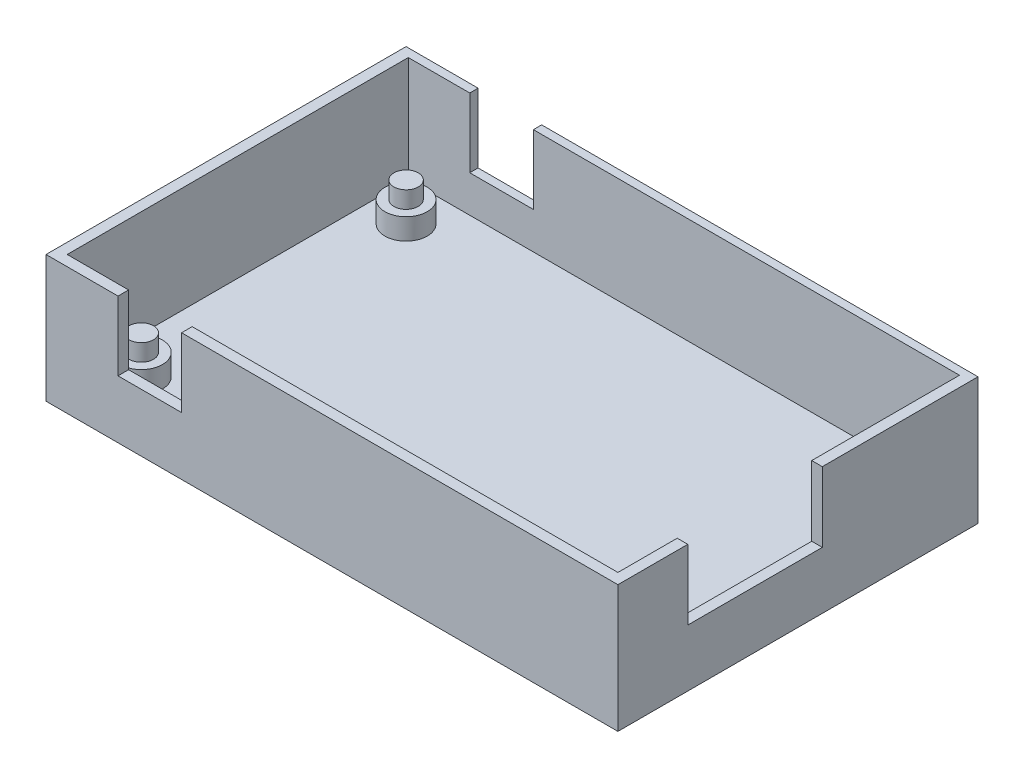
ISO-10303-21;
HEADER;
FILE_DESCRIPTION(('STEP AP214'),'2;1');
FILE_NAME('part.step','',(''),(''),'','','');
FILE_SCHEMA(('AUTOMOTIVE_DESIGN { 1 0 10303 214 1 1 1 1 }'));
ENDSEC;
DATA;
#1=APPLICATION_CONTEXT('core data for automotive mechanical design processes');
#2=APPLICATION_PROTOCOL_DEFINITION('international standard','automotive_design',2000,#1);
#3=PRODUCT_CONTEXT('',#1,'mechanical');
#4=PRODUCT('Part','Part','',(#3));
#5=PRODUCT_RELATED_PRODUCT_CATEGORY('part','',(#4));
#6=PRODUCT_DEFINITION_FORMATION('','',#4);
#7=PRODUCT_DEFINITION_CONTEXT('part definition',#1,'design');
#8=PRODUCT_DEFINITION('design','',#6,#7);
#9=PRODUCT_DEFINITION_SHAPE('','',#8);
#10=(LENGTH_UNIT() NAMED_UNIT(*) SI_UNIT(.MILLI.,.METRE.));
#11=(NAMED_UNIT(*) PLANE_ANGLE_UNIT() SI_UNIT($,.RADIAN.));
#12=(NAMED_UNIT(*) SI_UNIT($,.STERADIAN.) SOLID_ANGLE_UNIT());
#13=UNCERTAINTY_MEASURE_WITH_UNIT(LENGTH_MEASURE(1.E-05),#10,'distance_accuracy_value','');
#14=(GEOMETRIC_REPRESENTATION_CONTEXT(3) GLOBAL_UNCERTAINTY_ASSIGNED_CONTEXT((#13)) GLOBAL_UNIT_ASSIGNED_CONTEXT((#10,
#11,#12)) REPRESENTATION_CONTEXT('',''));
#15=CARTESIAN_POINT('',(0.,0.,0.));
#16=DIRECTION('',(0.,0.,1.));
#17=DIRECTION('',(1.,0.,0.));
#18=AXIS2_PLACEMENT_3D('',#15,#16,#17);
#19=CARTESIAN_POINT('',(0.,15.24,0.));
#20=DIRECTION('',(0.,1.,0.));
#21=DIRECTION('',(0.,0.,1.));
#22=AXIS2_PLACEMENT_3D('',#19,#20,#21);
#23=PLANE('',#22);
#24=DIRECTION('',(1.,0.,0.));
#25=VECTOR('',#24,1.);
#26=CARTESIAN_POINT('',(66.548,15.24,-8.382));
#27=LINE('',#26,#25);
#28=CARTESIAN_POINT('',(67.31,15.24,-8.382));
#29=VERTEX_POINT('',#28);
#30=CARTESIAN_POINT('',(68.58,15.24,-8.382));
#31=VERTEX_POINT('',#30);
#32=EDGE_CURVE('E197',#29,#31,#27,.T.);
#33=ORIENTED_EDGE('',*,*,#32,.F.);
#34=DIRECTION('',(0.,0.,-1.));
#35=VECTOR('',#34,1.);
#36=CARTESIAN_POINT('',(67.31,15.24,-1.27));
#37=LINE('',#36,#35);
#38=CARTESIAN_POINT('',(67.31,15.24,-1.27));
#39=VERTEX_POINT('',#38);
#40=EDGE_CURVE('E281',#39,#29,#37,.T.);
#41=ORIENTED_EDGE('',*,*,#40,.F.);
#42=DIRECTION('',(1.,0.,0.));
#43=VECTOR('',#42,1.);
#44=CARTESIAN_POINT('',(1.27000000000001,15.24,-1.27));
#45=LINE('',#44,#43);
#46=CARTESIAN_POINT('',(16.256,15.24,-1.27));
#47=VERTEX_POINT('',#46);
#48=EDGE_CURVE('E276',#47,#39,#45,.T.);
#49=ORIENTED_EDGE('',*,*,#48,.F.);
#50=DIRECTION('',(0.,0.,1.));
#51=VECTOR('',#50,1.);
#52=CARTESIAN_POINT('',(16.256,15.24,-43.18));
#53=LINE('',#52,#51);
#54=CARTESIAN_POINT('',(16.256,15.24,0.));
#55=VERTEX_POINT('',#54);
#56=EDGE_CURVE('E227',#47,#55,#53,.T.);
#57=ORIENTED_EDGE('',*,*,#56,.T.);
#58=DIRECTION('',(1.,0.,0.));
#59=VECTOR('',#58,1.);
#60=CARTESIAN_POINT('',(0.,15.24,0.));
#61=LINE('',#60,#59);
#62=CARTESIAN_POINT('',(68.58,15.24,0.));
#63=VERTEX_POINT('',#62);
#64=EDGE_CURVE('E311',#55,#63,#61,.T.);
#65=ORIENTED_EDGE('',*,*,#64,.T.);
#66=DIRECTION('',(0.,0.,-1.));
#67=VECTOR('',#66,1.);
#68=CARTESIAN_POINT('',(68.58,15.24,0.));
#69=LINE('',#68,#67);
#70=EDGE_CURVE('E315',#63,#31,#69,.T.);
#71=ORIENTED_EDGE('',*,*,#70,.T.);
#72=EDGE_LOOP('',(#33,#41,#49,#57,#65,#71));
#73=FACE_BOUND('',#72,.T.);
#74=ADVANCED_FACE('F33',(#73),#23,.T.);
#75=DIRECTION('',(0.,0.,1.));
#76=VECTOR('',#75,1.);
#77=CARTESIAN_POINT('',(8.636,15.24,-43.18));
#78=LINE('',#77,#76);
#79=CARTESIAN_POINT('',(8.636,15.24,-43.18));
#80=VERTEX_POINT('',#79);
#81=CARTESIAN_POINT('',(8.636,15.24,-42.1783502455858));
#82=VERTEX_POINT('',#81);
#83=EDGE_CURVE('E220',#80,#82,#78,.T.);
#84=ORIENTED_EDGE('',*,*,#83,.F.);
#85=DIRECTION('',(-1.,0.,0.));
#86=VECTOR('',#85,1.);
#87=CARTESIAN_POINT('',(68.58,15.24,-43.18));
#88=LINE('',#87,#86);
#89=CARTESIAN_POINT('',(0.,15.24,-43.18));
#90=VERTEX_POINT('',#89);
#91=EDGE_CURVE('E304',#80,#90,#88,.T.);
#92=ORIENTED_EDGE('',*,*,#91,.T.);
#93=DIRECTION('',(0.,0.,1.));
#94=VECTOR('',#93,1.);
#95=CARTESIAN_POINT('',(0.,15.24,-43.18));
#96=LINE('',#95,#94);
#97=CARTESIAN_POINT('',(0.,15.24,0.));
#98=VERTEX_POINT('',#97);
#99=EDGE_CURVE('E308',#90,#98,#96,.T.);
#100=ORIENTED_EDGE('',*,*,#99,.T.);
#101=CARTESIAN_POINT('',(8.636,15.24,0.));
#102=VERTEX_POINT('',#101);
#103=EDGE_CURVE('E312',#98,#102,#61,.T.);
#104=ORIENTED_EDGE('',*,*,#103,.T.);
#105=CARTESIAN_POINT('',(8.636,15.24,-1.27));
#106=VERTEX_POINT('',#105);
#107=EDGE_CURVE('E223',#106,#102,#78,.T.);
#108=ORIENTED_EDGE('',*,*,#107,.F.);
#109=CARTESIAN_POINT('',(1.27000000000001,15.24,-1.27));
#110=VERTEX_POINT('',#109);
#111=EDGE_CURVE('E277',#110,#106,#45,.T.);
#112=ORIENTED_EDGE('',*,*,#111,.F.);
#113=DIRECTION('',(0.,0.,1.));
#114=VECTOR('',#113,1.);
#115=CARTESIAN_POINT('',(1.27,15.24,-42.171922196319));
#116=LINE('',#115,#114);
#117=CARTESIAN_POINT('',(1.27,15.24,-42.171922196319));
#118=VERTEX_POINT('',#117);
#119=EDGE_CURVE('E273',#118,#110,#116,.T.);
#120=ORIENTED_EDGE('',*,*,#119,.F.);
#121=DIRECTION('',(-0.99999961922825,0.,0.000872664515221241));
#122=VECTOR('',#121,1.);
#123=CARTESIAN_POINT('',(67.31,15.24,-42.2295529828484));
#124=LINE('',#123,#122);
#125=EDGE_CURVE('E274',#82,#118,#124,.T.);
#126=ORIENTED_EDGE('',*,*,#125,.F.);
#127=EDGE_LOOP('',(#84,#92,#100,#104,#108,#112,#120,#126));
#128=FACE_BOUND('',#127,.T.);
#129=ADVANCED_FACE('F386',(#128),#23,.T.);
#130=CARTESIAN_POINT('',(62.865,5.08,-37.465));
#131=DIRECTION('',(0.,1.,0.));
#132=DIRECTION('',(0.,0.,1.));
#133=AXIS2_PLACEMENT_3D('',#130,#131,#132);
#134=PLANE('',#133);
#135=CARTESIAN_POINT('',(62.865,5.08,-37.465));
#136=DIRECTION('',(0.,1.,0.));
#137=DIRECTION('',(0.,0.,1.));
#138=AXIS2_PLACEMENT_3D('',#135,#136,#137);
#139=CIRCLE('',#138,2.54);
#140=CARTESIAN_POINT('',(62.865,5.08,-34.925));
#141=VERTEX_POINT('',#140);
#142=EDGE_CURVE('E324',#141,#141,#139,.T.);
#143=ORIENTED_EDGE('',*,*,#142,.T.);
#144=EDGE_LOOP('',(#143));
#145=FACE_BOUND('',#144,.T.);
#146=CARTESIAN_POINT('',(62.865,5.08,-37.465));
#147=DIRECTION('',(0.,1.,0.));
#148=DIRECTION('',(0.,0.,1.));
#149=AXIS2_PLACEMENT_3D('',#146,#147,#148);
#150=CIRCLE('',#149,1.4605);
#151=CARTESIAN_POINT('',(62.865,5.08,-36.0045));
#152=VERTEX_POINT('',#151);
#153=EDGE_CURVE('E245',#152,#152,#150,.T.);
#154=ORIENTED_EDGE('',*,*,#153,.F.);
#155=EDGE_LOOP('',(#154));
#156=FACE_BOUND('',#155,.T.);
#157=ADVANCED_FACE('F398',(#145,#156),#134,.T.);
#158=CARTESIAN_POINT('',(62.865,5.08,-5.715));
#159=DIRECTION('',(0.,1.,0.));
#160=DIRECTION('',(0.,0.,1.));
#161=AXIS2_PLACEMENT_3D('',#158,#159,#160);
#162=PLANE('',#161);
#163=CARTESIAN_POINT('',(62.865,5.08,-5.715));
#164=DIRECTION('',(0.,1.,0.));
#165=DIRECTION('',(0.,0.,1.));
#166=AXIS2_PLACEMENT_3D('',#163,#164,#165);
#167=CIRCLE('',#166,2.54);
#168=CARTESIAN_POINT('',(62.865,5.08,-3.175));
#169=VERTEX_POINT('',#168);
#170=EDGE_CURVE('E318',#169,#169,#167,.T.);
#171=ORIENTED_EDGE('',*,*,#170,.T.);
#172=EDGE_LOOP('',(#171));
#173=FACE_BOUND('',#172,.T.);
#174=CARTESIAN_POINT('',(62.865,5.08,-5.715));
#175=DIRECTION('',(0.,1.,0.));
#176=DIRECTION('',(0.,0.,1.));
#177=AXIS2_PLACEMENT_3D('',#174,#175,#176);
#178=CIRCLE('',#177,1.4605);
#179=CARTESIAN_POINT('',(62.865,5.08,-4.2545));
#180=VERTEX_POINT('',#179);
#181=EDGE_CURVE('E249',#180,#180,#178,.T.);
#182=ORIENTED_EDGE('',*,*,#181,.F.);
#183=EDGE_LOOP('',(#182));
#184=FACE_BOUND('',#183,.T.);
#185=ADVANCED_FACE('F403',(#173,#184),#162,.T.);
#186=CARTESIAN_POINT('',(5.71500000000001,5.08,-5.715));
#187=DIRECTION('',(0.,1.,0.));
#188=DIRECTION('',(0.,0.,1.));
#189=AXIS2_PLACEMENT_3D('',#186,#187,#188);
#190=PLANE('',#189);
#191=CARTESIAN_POINT('',(5.71500000000001,5.08,-5.715));
#192=DIRECTION('',(0.,1.,0.));
#193=DIRECTION('',(0.,0.,1.));
#194=AXIS2_PLACEMENT_3D('',#191,#192,#193);
#195=CIRCLE('',#194,2.54);
#196=CARTESIAN_POINT('',(5.71500000000001,5.08,-3.175));
#197=VERTEX_POINT('',#196);
#198=EDGE_CURVE('E321',#197,#197,#195,.T.);
#199=ORIENTED_EDGE('',*,*,#198,.T.);
#200=EDGE_LOOP('',(#199));
#201=FACE_BOUND('',#200,.T.);
#202=CARTESIAN_POINT('',(5.71500000000001,5.08,-5.715));
#203=DIRECTION('',(0.,1.,0.));
#204=DIRECTION('',(0.,0.,1.));
#205=AXIS2_PLACEMENT_3D('',#202,#203,#204);
#206=CIRCLE('',#205,1.4605);
#207=CARTESIAN_POINT('',(5.71500000000001,5.08,-4.2545));
#208=VERTEX_POINT('',#207);
#209=EDGE_CURVE('E255',#208,#208,#206,.T.);
#210=ORIENTED_EDGE('',*,*,#209,.F.);
#211=EDGE_LOOP('',(#210));
#212=FACE_BOUND('',#211,.T.);
#213=ADVANCED_FACE('F405',(#201,#212),#190,.T.);
#214=CARTESIAN_POINT('',(5.715,5.08,-37.465));
#215=DIRECTION('',(0.,1.,0.));
#216=DIRECTION('',(0.,0.,1.));
#217=AXIS2_PLACEMENT_3D('',#214,#215,#216);
#218=PLANE('',#217);
#219=CARTESIAN_POINT('',(5.715,5.08,-37.465));
#220=DIRECTION('',(0.,1.,0.));
#221=DIRECTION('',(0.,0.,1.));
#222=AXIS2_PLACEMENT_3D('',#219,#220,#221);
#223=CIRCLE('',#222,2.54);
#224=CARTESIAN_POINT('',(5.715,5.08,-34.925));
#225=VERTEX_POINT('',#224);
#226=EDGE_CURVE('E327',#225,#225,#223,.T.);
#227=ORIENTED_EDGE('',*,*,#226,.T.);
#228=EDGE_LOOP('',(#227));
#229=FACE_BOUND('',#228,.T.);
#230=CARTESIAN_POINT('',(5.715,5.08,-37.465));
#231=DIRECTION('',(0.,1.,0.));
#232=DIRECTION('',(0.,0.,1.));
#233=AXIS2_PLACEMENT_3D('',#230,#231,#232);
#234=CIRCLE('',#233,1.4605);
#235=CARTESIAN_POINT('',(5.715,5.08,-36.0045));
#236=VERTEX_POINT('',#235);
#237=EDGE_CURVE('E261',#236,#236,#234,.T.);
#238=ORIENTED_EDGE('',*,*,#237,.F.);
#239=EDGE_LOOP('',(#238));
#240=FACE_BOUND('',#239,.T.);
#241=ADVANCED_FACE('F365',(#229,#240),#218,.T.);
#242=CARTESIAN_POINT('',(0.,2.54,0.));
#243=DIRECTION('',(0.,-1.,0.));
#244=DIRECTION('',(0.,0.,-1.));
#245=AXIS2_PLACEMENT_3D('',#242,#243,#244);
#246=PLANE('',#245);
#247=DIRECTION('',(0.,0.,-1.));
#248=VECTOR('',#247,1.);
#249=CARTESIAN_POINT('',(67.31,2.54,-1.27));
#250=LINE('',#249,#248);
#251=CARTESIAN_POINT('',(67.31,2.54,-1.27));
#252=VERTEX_POINT('',#251);
#253=CARTESIAN_POINT('',(67.31,2.54,-42.2295529828484));
#254=VERTEX_POINT('',#253);
#255=EDGE_CURVE('E293',#252,#254,#250,.T.);
#256=ORIENTED_EDGE('',*,*,#255,.T.);
#257=DIRECTION('',(-0.99999961922825,0.,0.000872664515221241));
#258=VECTOR('',#257,1.);
#259=CARTESIAN_POINT('',(67.31,2.54,-42.2295529828484));
#260=LINE('',#259,#258);
#261=CARTESIAN_POINT('',(1.27,2.54,-42.171922196319));
#262=VERTEX_POINT('',#261);
#263=EDGE_CURVE('E267',#254,#262,#260,.T.);
#264=ORIENTED_EDGE('',*,*,#263,.T.);
#265=DIRECTION('',(0.,0.,1.));
#266=VECTOR('',#265,1.);
#267=CARTESIAN_POINT('',(1.27,2.54,-42.171922196319));
#268=LINE('',#267,#266);
#269=CARTESIAN_POINT('',(1.27000000000001,2.54,-1.27));
#270=VERTEX_POINT('',#269);
#271=EDGE_CURVE('E287',#262,#270,#268,.T.);
#272=ORIENTED_EDGE('',*,*,#271,.T.);
#273=DIRECTION('',(1.,0.,0.));
#274=VECTOR('',#273,1.);
#275=CARTESIAN_POINT('',(1.27000000000001,2.54,-1.27));
#276=LINE('',#275,#274);
#277=EDGE_CURVE('E290',#270,#252,#276,.T.);
#278=ORIENTED_EDGE('',*,*,#277,.T.);
#279=EDGE_LOOP('',(#256,#264,#272,#278));
#280=FACE_BOUND('',#279,.T.);
#281=CARTESIAN_POINT('',(5.71500000000001,2.54,-5.715));
#282=DIRECTION('',(0.,-1.,0.));
#283=DIRECTION('',(0.,0.,-1.));
#284=AXIS2_PLACEMENT_3D('',#281,#282,#283);
#285=CIRCLE('',#284,2.54);
#286=CARTESIAN_POINT('',(5.71500000000001,2.54,-8.255));
#287=VERTEX_POINT('',#286);
#288=EDGE_CURVE('E41',#287,#287,#285,.F.);
#289=ORIENTED_EDGE('',*,*,#288,.F.);
#290=EDGE_LOOP('',(#289));
#291=FACE_BOUND('',#290,.T.);
#292=CARTESIAN_POINT('',(5.715,2.54,-37.465));
#293=DIRECTION('',(0.,-1.,0.));
#294=DIRECTION('',(0.,0.,-1.));
#295=AXIS2_PLACEMENT_3D('',#292,#293,#294);
#296=CIRCLE('',#295,2.54);
#297=CARTESIAN_POINT('',(5.715,2.54,-40.005));
#298=VERTEX_POINT('',#297);
#299=EDGE_CURVE('E351',#298,#298,#296,.F.);
#300=ORIENTED_EDGE('',*,*,#299,.F.);
#301=EDGE_LOOP('',(#300));
#302=FACE_BOUND('',#301,.T.);
#303=CARTESIAN_POINT('',(62.865,2.54,-37.465));
#304=DIRECTION('',(0.,-1.,0.));
#305=DIRECTION('',(0.,0.,-1.));
#306=AXIS2_PLACEMENT_3D('',#303,#304,#305);
#307=CIRCLE('',#306,2.54);
#308=CARTESIAN_POINT('',(62.865,2.54,-40.005));
#309=VERTEX_POINT('',#308);
#310=EDGE_CURVE('E354',#309,#309,#307,.F.);
#311=ORIENTED_EDGE('',*,*,#310,.F.);
#312=EDGE_LOOP('',(#311));
#313=FACE_BOUND('',#312,.T.);
#314=CARTESIAN_POINT('',(62.865,2.54,-5.715));
#315=DIRECTION('',(0.,-1.,0.));
#316=DIRECTION('',(0.,0.,-1.));
#317=AXIS2_PLACEMENT_3D('',#314,#315,#316);
#318=CIRCLE('',#317,2.54);
#319=CARTESIAN_POINT('',(62.865,2.54,-8.25499999999999));
#320=VERTEX_POINT('',#319);
#321=EDGE_CURVE('E11',#320,#320,#318,.F.);
#322=ORIENTED_EDGE('',*,*,#321,.F.);
#323=EDGE_LOOP('',(#322));
#324=FACE_BOUND('',#323,.T.);
#325=ADVANCED_FACE('F361',(#280,#291,#302,#313,#324),#246,.F.);
#326=CARTESIAN_POINT('',(5.715,5.08,-37.465));
#327=DIRECTION('',(0.,-1.,0.));
#328=DIRECTION('',(0.,0.,-1.));
#329=AXIS2_PLACEMENT_3D('',#326,#327,#328);
#330=CYLINDRICAL_SURFACE('',#329,2.54);
#331=ORIENTED_EDGE('',*,*,#226,.F.);
#332=EDGE_LOOP('',(#331));
#333=FACE_BOUND('',#332,.T.);
#334=ORIENTED_EDGE('',*,*,#299,.T.);
#335=EDGE_LOOP('',(#334));
#336=FACE_BOUND('',#335,.T.);
#337=ADVANCED_FACE('F364',(#333,#336),#330,.T.);
#338=CARTESIAN_POINT('',(62.865,5.08,-37.465));
#339=DIRECTION('',(0.,-1.,0.));
#340=DIRECTION('',(0.,0.,-1.));
#341=AXIS2_PLACEMENT_3D('',#338,#339,#340);
#342=CYLINDRICAL_SURFACE('',#341,2.54);
#343=ORIENTED_EDGE('',*,*,#142,.F.);
#344=EDGE_LOOP('',(#343));
#345=FACE_BOUND('',#344,.T.);
#346=ORIENTED_EDGE('',*,*,#310,.T.);
#347=EDGE_LOOP('',(#346));
#348=FACE_BOUND('',#347,.T.);
#349=ADVANCED_FACE('F387',(#345,#348),#342,.T.);
#350=CARTESIAN_POINT('',(5.71500000000001,5.08,-5.715));
#351=DIRECTION('',(0.,-1.,0.));
#352=DIRECTION('',(0.,0.,-1.));
#353=AXIS2_PLACEMENT_3D('',#350,#351,#352);
#354=CYLINDRICAL_SURFACE('',#353,2.54);
#355=ORIENTED_EDGE('',*,*,#198,.F.);
#356=EDGE_LOOP('',(#355));
#357=FACE_BOUND('',#356,.T.);
#358=ORIENTED_EDGE('',*,*,#288,.T.);
#359=EDGE_LOOP('',(#358));
#360=FACE_BOUND('',#359,.T.);
#361=ADVANCED_FACE('F359',(#357,#360),#354,.T.);
#362=CARTESIAN_POINT('',(62.865,5.08,-5.715));
#363=DIRECTION('',(0.,-1.,0.));
#364=DIRECTION('',(0.,0.,-1.));
#365=AXIS2_PLACEMENT_3D('',#362,#363,#364);
#366=CYLINDRICAL_SURFACE('',#365,2.54);
#367=ORIENTED_EDGE('',*,*,#170,.F.);
#368=EDGE_LOOP('',(#367));
#369=FACE_BOUND('',#368,.T.);
#370=ORIENTED_EDGE('',*,*,#321,.T.);
#371=EDGE_LOOP('',(#370));
#372=FACE_BOUND('',#371,.T.);
#373=ADVANCED_FACE('F374',(#369,#372),#366,.T.);
#374=DIRECTION('',(1.,0.,0.));
#375=VECTOR('',#374,1.);
#376=CARTESIAN_POINT('',(66.548,15.24,-24.511));
#377=LINE('',#376,#375);
#378=CARTESIAN_POINT('',(67.31,15.24,-24.511));
#379=VERTEX_POINT('',#378);
#380=CARTESIAN_POINT('',(68.58,15.24,-24.511));
#381=VERTEX_POINT('',#380);
#382=EDGE_CURVE('E181',#379,#381,#377,.T.);
#383=ORIENTED_EDGE('',*,*,#382,.T.);
#384=CARTESIAN_POINT('',(68.58,15.24,-43.18));
#385=VERTEX_POINT('',#384);
#386=EDGE_CURVE('E192',#381,#385,#69,.T.);
#387=ORIENTED_EDGE('',*,*,#386,.T.);
#388=CARTESIAN_POINT('',(16.256,15.24,-43.18));
#389=VERTEX_POINT('',#388);
#390=EDGE_CURVE('E305',#385,#389,#88,.T.);
#391=ORIENTED_EDGE('',*,*,#390,.T.);
#392=CARTESIAN_POINT('',(16.256,15.24,-42.1849999517238));
#393=VERTEX_POINT('',#392);
#394=EDGE_CURVE('E224',#389,#393,#53,.T.);
#395=ORIENTED_EDGE('',*,*,#394,.T.);
#396=CARTESIAN_POINT('',(67.31,15.24,-42.2295529828484));
#397=VERTEX_POINT('',#396);
#398=EDGE_CURVE('E270',#397,#393,#124,.T.);
#399=ORIENTED_EDGE('',*,*,#398,.F.);
#400=EDGE_CURVE('E280',#379,#397,#37,.T.);
#401=ORIENTED_EDGE('',*,*,#400,.F.);
#402=EDGE_LOOP('',(#383,#387,#391,#395,#399,#401));
#403=FACE_BOUND('',#402,.T.);
#404=ADVANCED_FACE('F376',(#403),#23,.T.);
#405=CARTESIAN_POINT('',(67.31,15.24,-42.2295529828484));
#406=DIRECTION('',(0.000872664515221241,0.,0.999999619228249));
#407=DIRECTION('',(0.999999619228249,0.,-0.000872664515221241));
#408=AXIS2_PLACEMENT_3D('',#405,#406,#407);
#409=PLANE('',#408);
#410=DIRECTION('',(0.,-1.,0.));
#411=VECTOR('',#410,1.);
#412=CARTESIAN_POINT('',(8.636,15.24,-42.1783502455858));
#413=LINE('',#412,#411);
#414=CARTESIAN_POINT('',(8.63600000000001,6.9543676,-42.1783502455858));
#415=VERTEX_POINT('',#414);
#416=EDGE_CURVE('E243',#82,#415,#413,.T.);
#417=ORIENTED_EDGE('',*,*,#416,.F.);
#418=ORIENTED_EDGE('',*,*,#125,.T.);
#419=DIRECTION('',(0.,-1.,0.));
#420=VECTOR('',#419,1.);
#421=CARTESIAN_POINT('',(1.27,15.24,-42.171922196319));
#422=LINE('',#421,#420);
#423=EDGE_CURVE('E301',#118,#262,#422,.T.);
#424=ORIENTED_EDGE('',*,*,#423,.T.);
#425=ORIENTED_EDGE('',*,*,#263,.F.);
#426=DIRECTION('',(0.,-1.,0.));
#427=VECTOR('',#426,1.);
#428=CARTESIAN_POINT('',(67.31,15.24,-42.2295529828484));
#429=LINE('',#428,#427);
#430=EDGE_CURVE('E284',#397,#254,#429,.T.);
#431=ORIENTED_EDGE('',*,*,#430,.F.);
#432=ORIENTED_EDGE('',*,*,#398,.T.);
#433=DIRECTION('',(0.,1.,0.));
#434=VECTOR('',#433,1.);
#435=CARTESIAN_POINT('',(16.256,15.24,-42.1849999517238));
#436=LINE('',#435,#434);
#437=CARTESIAN_POINT('',(16.256,6.9543676,-42.1849999517238));
#438=VERTEX_POINT('',#437);
#439=EDGE_CURVE('E239',#438,#393,#436,.T.);
#440=ORIENTED_EDGE('',*,*,#439,.F.);
#441=DIRECTION('',(0.999999619228249,0.,-0.000872664515221241));
#442=VECTOR('',#441,1.);
#443=CARTESIAN_POINT('',(67.31,6.9543676,-42.2295529828484));
#444=LINE('',#443,#442);
#445=EDGE_CURVE('E235',#415,#438,#444,.T.);
#446=ORIENTED_EDGE('',*,*,#445,.F.);
#447=EDGE_LOOP('',(#417,#418,#424,#425,#431,#432,#440,#446));
#448=FACE_BOUND('',#447,.T.);
#449=ADVANCED_FACE('F383',(#448),#409,.T.);
#450=CARTESIAN_POINT('',(1.27,15.24,-42.171922196319));
#451=DIRECTION('',(1.,0.,0.));
#452=DIRECTION('',(0.,0.,-1.));
#453=AXIS2_PLACEMENT_3D('',#450,#451,#452);
#454=PLANE('',#453);
#455=ORIENTED_EDGE('',*,*,#271,.F.);
#456=ORIENTED_EDGE('',*,*,#423,.F.);
#457=ORIENTED_EDGE('',*,*,#119,.T.);
#458=DIRECTION('',(0.,-1.,0.));
#459=VECTOR('',#458,1.);
#460=CARTESIAN_POINT('',(1.27000000000001,15.24,-1.27));
#461=LINE('',#460,#459);
#462=EDGE_CURVE('E299',#110,#270,#461,.T.);
#463=ORIENTED_EDGE('',*,*,#462,.T.);
#464=EDGE_LOOP('',(#455,#456,#457,#463));
#465=FACE_BOUND('',#464,.T.);
#466=ADVANCED_FACE('F454',(#465),#454,.T.);
#467=CARTESIAN_POINT('',(1.27000000000001,15.24,-1.27));
#468=DIRECTION('',(0.,0.,-1.));
#469=DIRECTION('',(-1.,0.,0.));
#470=AXIS2_PLACEMENT_3D('',#467,#468,#469);
#471=PLANE('',#470);
#472=DIRECTION('',(0.,1.,0.));
#473=VECTOR('',#472,1.);
#474=CARTESIAN_POINT('',(8.636,15.24,-1.27));
#475=LINE('',#474,#473);
#476=CARTESIAN_POINT('',(8.636,6.9543676,-1.27));
#477=VERTEX_POINT('',#476);
#478=EDGE_CURVE('E241',#477,#106,#475,.T.);
#479=ORIENTED_EDGE('',*,*,#478,.F.);
#480=DIRECTION('',(-1.,0.,0.));
#481=VECTOR('',#480,1.);
#482=CARTESIAN_POINT('',(1.27000000000001,6.9543676,-1.27));
#483=LINE('',#482,#481);
#484=CARTESIAN_POINT('',(16.256,6.9543676,-1.27));
#485=VERTEX_POINT('',#484);
#486=EDGE_CURVE('E222',#485,#477,#483,.T.);
#487=ORIENTED_EDGE('',*,*,#486,.F.);
#488=DIRECTION('',(0.,-1.,0.));
#489=VECTOR('',#488,1.);
#490=CARTESIAN_POINT('',(16.256,15.24,-1.27));
#491=LINE('',#490,#489);
#492=EDGE_CURVE('E237',#47,#485,#491,.T.);
#493=ORIENTED_EDGE('',*,*,#492,.F.);
#494=ORIENTED_EDGE('',*,*,#48,.T.);
#495=DIRECTION('',(0.,-1.,0.));
#496=VECTOR('',#495,1.);
#497=CARTESIAN_POINT('',(67.31,15.24,-1.27));
#498=LINE('',#497,#496);
#499=EDGE_CURVE('E297',#39,#252,#498,.T.);
#500=ORIENTED_EDGE('',*,*,#499,.T.);
#501=ORIENTED_EDGE('',*,*,#277,.F.);
#502=ORIENTED_EDGE('',*,*,#462,.F.);
#503=ORIENTED_EDGE('',*,*,#111,.T.);
#504=EDGE_LOOP('',(#479,#487,#493,#494,#500,#501,#502,#503));
#505=FACE_BOUND('',#504,.T.);
#506=ADVANCED_FACE('F451',(#505),#471,.T.);
#507=CARTESIAN_POINT('',(67.31,15.24,-1.27));
#508=DIRECTION('',(-1.,0.,0.));
#509=DIRECTION('',(0.,0.,1.));
#510=AXIS2_PLACEMENT_3D('',#507,#508,#509);
#511=PLANE('',#510);
#512=DIRECTION('',(0.,1.,0.));
#513=VECTOR('',#512,1.);
#514=CARTESIAN_POINT('',(67.31,15.24,-8.382));
#515=LINE('',#514,#513);
#516=CARTESIAN_POINT('',(67.31,6.858,-8.382));
#517=VERTEX_POINT('',#516);
#518=EDGE_CURVE('E203',#517,#29,#515,.T.);
#519=ORIENTED_EDGE('',*,*,#518,.F.);
#520=DIRECTION('',(0.,0.,1.));
#521=VECTOR('',#520,1.);
#522=CARTESIAN_POINT('',(67.31,6.858,-1.27));
#523=LINE('',#522,#521);
#524=CARTESIAN_POINT('',(67.31,6.858,-24.511));
#525=VERTEX_POINT('',#524);
#526=EDGE_CURVE('E199',#525,#517,#523,.T.);
#527=ORIENTED_EDGE('',*,*,#526,.F.);
#528=DIRECTION('',(0.,-1.,0.));
#529=VECTOR('',#528,1.);
#530=CARTESIAN_POINT('',(67.31,15.24,-24.511));
#531=LINE('',#530,#529);
#532=EDGE_CURVE('E178',#379,#525,#531,.T.);
#533=ORIENTED_EDGE('',*,*,#532,.F.);
#534=ORIENTED_EDGE('',*,*,#400,.T.);
#535=ORIENTED_EDGE('',*,*,#430,.T.);
#536=ORIENTED_EDGE('',*,*,#255,.F.);
#537=ORIENTED_EDGE('',*,*,#499,.F.);
#538=ORIENTED_EDGE('',*,*,#40,.T.);
#539=EDGE_LOOP('',(#519,#527,#533,#534,#535,#536,#537,#538));
#540=FACE_BOUND('',#539,.T.);
#541=ADVANCED_FACE('F447',(#540),#511,.T.);
#542=CARTESIAN_POINT('',(0.,0.,0.));
#543=DIRECTION('',(0.,-1.,0.));
#544=DIRECTION('',(0.,0.,-1.));
#545=AXIS2_PLACEMENT_3D('',#542,#543,#544);
#546=PLANE('',#545);
#547=DIRECTION('',(0.,0.,1.));
#548=VECTOR('',#547,1.);
#549=CARTESIAN_POINT('',(0.,0.,0.));
#550=LINE('',#549,#548);
#551=CARTESIAN_POINT('',(0.,0.,-43.18));
#552=VERTEX_POINT('',#551);
#553=CARTESIAN_POINT('',(0.,0.,0.));
#554=VERTEX_POINT('',#553);
#555=EDGE_CURVE('E330',#552,#554,#550,.T.);
#556=ORIENTED_EDGE('',*,*,#555,.F.);
#557=DIRECTION('',(-1.,0.,0.));
#558=VECTOR('',#557,1.);
#559=CARTESIAN_POINT('',(0.,0.,-43.18));
#560=LINE('',#559,#558);
#561=CARTESIAN_POINT('',(68.58,0.,-43.18));
#562=VERTEX_POINT('',#561);
#563=EDGE_CURVE('E337',#562,#552,#560,.T.);
#564=ORIENTED_EDGE('',*,*,#563,.F.);
#565=DIRECTION('',(0.,0.,-1.));
#566=VECTOR('',#565,1.);
#567=CARTESIAN_POINT('',(68.58,0.,0.));
#568=LINE('',#567,#566);
#569=CARTESIAN_POINT('',(68.58,0.,0.));
#570=VERTEX_POINT('',#569);
#571=EDGE_CURVE('E335',#570,#562,#568,.T.);
#572=ORIENTED_EDGE('',*,*,#571,.F.);
#573=DIRECTION('',(1.,0.,0.));
#574=VECTOR('',#573,1.);
#575=CARTESIAN_POINT('',(0.,0.,0.));
#576=LINE('',#575,#574);
#577=EDGE_CURVE('E333',#554,#570,#576,.T.);
#578=ORIENTED_EDGE('',*,*,#577,.F.);
#579=EDGE_LOOP('',(#556,#564,#572,#578));
#580=FACE_BOUND('',#579,.T.);
#581=ADVANCED_FACE('F450',(#580),#546,.T.);
#582=CARTESIAN_POINT('',(0.,2.54,-43.18));
#583=DIRECTION('',(0.,0.,1.));
#584=DIRECTION('',(1.,0.,0.));
#585=AXIS2_PLACEMENT_3D('',#582,#583,#584);
#586=PLANE('',#585);
#587=ORIENTED_EDGE('',*,*,#91,.F.);
#588=DIRECTION('',(0.,-1.,0.));
#589=VECTOR('',#588,1.);
#590=CARTESIAN_POINT('',(8.636,15.24,-43.18));
#591=LINE('',#590,#589);
#592=CARTESIAN_POINT('',(8.636,6.9543676,-43.18));
#593=VERTEX_POINT('',#592);
#594=EDGE_CURVE('E206',#80,#593,#591,.T.);
#595=ORIENTED_EDGE('',*,*,#594,.T.);
#596=DIRECTION('',(1.,0.,0.));
#597=VECTOR('',#596,1.);
#598=CARTESIAN_POINT('',(8.636,6.9543676,-43.18));
#599=LINE('',#598,#597);
#600=CARTESIAN_POINT('',(16.256,6.9543676,-43.18));
#601=VERTEX_POINT('',#600);
#602=EDGE_CURVE('E209',#593,#601,#599,.T.);
#603=ORIENTED_EDGE('',*,*,#602,.T.);
#604=DIRECTION('',(0.,1.,0.));
#605=VECTOR('',#604,1.);
#606=CARTESIAN_POINT('',(16.256,15.24,-43.18));
#607=LINE('',#606,#605);
#608=EDGE_CURVE('E56',#601,#389,#607,.T.);
#609=ORIENTED_EDGE('',*,*,#608,.T.);
#610=ORIENTED_EDGE('',*,*,#390,.F.);
#611=DIRECTION('',(0.,-1.,0.));
#612=VECTOR('',#611,1.);
#613=CARTESIAN_POINT('',(68.58,2.54,-43.18));
#614=LINE('',#613,#612);
#615=EDGE_CURVE('E342',#385,#562,#614,.T.);
#616=ORIENTED_EDGE('',*,*,#615,.T.);
#617=ORIENTED_EDGE('',*,*,#563,.T.);
#618=DIRECTION('',(0.,-1.,0.));
#619=VECTOR('',#618,1.);
#620=CARTESIAN_POINT('',(0.,2.54,-43.18));
#621=LINE('',#620,#619);
#622=EDGE_CURVE('E339',#90,#552,#621,.T.);
#623=ORIENTED_EDGE('',*,*,#622,.F.);
#624=EDGE_LOOP('',(#587,#595,#603,#609,#610,#616,#617,#623));
#625=FACE_BOUND('',#624,.T.);
#626=ADVANCED_FACE('F481',(#625),#586,.F.);
#627=CARTESIAN_POINT('',(68.58,2.54,0.));
#628=DIRECTION('',(-1.,0.,0.));
#629=DIRECTION('',(0.,0.,1.));
#630=AXIS2_PLACEMENT_3D('',#627,#628,#629);
#631=PLANE('',#630);
#632=DIRECTION('',(0.,0.,-1.));
#633=VECTOR('',#632,1.);
#634=CARTESIAN_POINT('',(68.58,6.858,-8.382));
#635=LINE('',#634,#633);
#636=CARTESIAN_POINT('',(68.58,6.858,-8.382));
#637=VERTEX_POINT('',#636);
#638=CARTESIAN_POINT('',(68.58,6.858,-24.511));
#639=VERTEX_POINT('',#638);
#640=EDGE_CURVE('E185',#637,#639,#635,.T.);
#641=ORIENTED_EDGE('',*,*,#640,.F.);
#642=DIRECTION('',(0.,-1.,0.));
#643=VECTOR('',#642,1.);
#644=CARTESIAN_POINT('',(68.58,15.24,-8.382));
#645=LINE('',#644,#643);
#646=EDGE_CURVE('E48',#31,#637,#645,.T.);
#647=ORIENTED_EDGE('',*,*,#646,.F.);
#648=ORIENTED_EDGE('',*,*,#70,.F.);
#649=DIRECTION('',(0.,-1.,0.));
#650=VECTOR('',#649,1.);
#651=CARTESIAN_POINT('',(68.58,2.54,0.));
#652=LINE('',#651,#650);
#653=EDGE_CURVE('E345',#63,#570,#652,.T.);
#654=ORIENTED_EDGE('',*,*,#653,.T.);
#655=ORIENTED_EDGE('',*,*,#571,.T.);
#656=ORIENTED_EDGE('',*,*,#615,.F.);
#657=ORIENTED_EDGE('',*,*,#386,.F.);
#658=DIRECTION('',(0.,1.,0.));
#659=VECTOR('',#658,1.);
#660=CARTESIAN_POINT('',(68.58,15.24,-24.511));
#661=LINE('',#660,#659);
#662=EDGE_CURVE('E175',#639,#381,#661,.T.);
#663=ORIENTED_EDGE('',*,*,#662,.F.);
#664=EDGE_LOOP('',(#641,#647,#648,#654,#655,#656,#657,#663));
#665=FACE_BOUND('',#664,.T.);
#666=ADVANCED_FACE('F190',(#665),#631,.F.);
#667=CARTESIAN_POINT('',(0.,2.54,0.));
#668=DIRECTION('',(0.,0.,-1.));
#669=DIRECTION('',(-1.,0.,0.));
#670=AXIS2_PLACEMENT_3D('',#667,#668,#669);
#671=PLANE('',#670);
#672=DIRECTION('',(1.,0.,0.));
#673=VECTOR('',#672,1.);
#674=CARTESIAN_POINT('',(8.636,6.9543676,0.));
#675=LINE('',#674,#673);
#676=CARTESIAN_POINT('',(8.636,6.9543676,0.));
#677=VERTEX_POINT('',#676);
#678=CARTESIAN_POINT('',(16.256,6.9543676,0.));
#679=VERTEX_POINT('',#678);
#680=EDGE_CURVE('E216',#677,#679,#675,.T.);
#681=ORIENTED_EDGE('',*,*,#680,.F.);
#682=DIRECTION('',(0.,-1.,0.));
#683=VECTOR('',#682,1.);
#684=CARTESIAN_POINT('',(8.636,15.24,0.));
#685=LINE('',#684,#683);
#686=EDGE_CURVE('E205',#102,#677,#685,.T.);
#687=ORIENTED_EDGE('',*,*,#686,.F.);
#688=ORIENTED_EDGE('',*,*,#103,.F.);
#689=DIRECTION('',(0.,-1.,0.));
#690=VECTOR('',#689,1.);
#691=CARTESIAN_POINT('',(0.,2.54,0.));
#692=LINE('',#691,#690);
#693=EDGE_CURVE('E348',#98,#554,#692,.T.);
#694=ORIENTED_EDGE('',*,*,#693,.T.);
#695=ORIENTED_EDGE('',*,*,#577,.T.);
#696=ORIENTED_EDGE('',*,*,#653,.F.);
#697=ORIENTED_EDGE('',*,*,#64,.F.);
#698=DIRECTION('',(0.,1.,0.));
#699=VECTOR('',#698,1.);
#700=CARTESIAN_POINT('',(16.256,15.24,0.));
#701=LINE('',#700,#699);
#702=EDGE_CURVE('E210',#679,#55,#701,.T.);
#703=ORIENTED_EDGE('',*,*,#702,.F.);
#704=EDGE_LOOP('',(#681,#687,#688,#694,#695,#696,#697,#703));
#705=FACE_BOUND('',#704,.T.);
#706=ADVANCED_FACE('F502',(#705),#671,.F.);
#707=CARTESIAN_POINT('',(0.,2.54,0.));
#708=DIRECTION('',(1.,0.,0.));
#709=DIRECTION('',(0.,0.,-1.));
#710=AXIS2_PLACEMENT_3D('',#707,#708,#709);
#711=PLANE('',#710);
#712=ORIENTED_EDGE('',*,*,#555,.T.);
#713=ORIENTED_EDGE('',*,*,#693,.F.);
#714=ORIENTED_EDGE('',*,*,#99,.F.);
#715=ORIENTED_EDGE('',*,*,#622,.T.);
#716=EDGE_LOOP('',(#712,#713,#714,#715));
#717=FACE_BOUND('',#716,.T.);
#718=ADVANCED_FACE('F35',(#717),#711,.F.);
#719=CARTESIAN_POINT('',(5.715,7.112,-37.465));
#720=DIRECTION('',(0.,-1.,0.));
#721=DIRECTION('',(0.,0.,-1.));
#722=AXIS2_PLACEMENT_3D('',#719,#720,#721);
#723=CYLINDRICAL_SURFACE('',#722,1.4605);
#724=CARTESIAN_POINT('',(5.715,7.112,-37.465));
#725=DIRECTION('',(0.,1.,0.));
#726=DIRECTION('',(0.,0.,1.));
#727=AXIS2_PLACEMENT_3D('',#724,#725,#726);
#728=CIRCLE('',#727,1.4605);
#729=CARTESIAN_POINT('',(5.715,7.112,-36.0045));
#730=VERTEX_POINT('',#729);
#731=EDGE_CURVE('E264',#730,#730,#728,.T.);
#732=ORIENTED_EDGE('',*,*,#731,.F.);
#733=EDGE_LOOP('',(#732));
#734=FACE_BOUND('',#733,.T.);
#735=ORIENTED_EDGE('',*,*,#237,.T.);
#736=EDGE_LOOP('',(#735));
#737=FACE_BOUND('',#736,.T.);
#738=ADVANCED_FACE('F442',(#734,#737),#723,.T.);
#739=CARTESIAN_POINT('',(5.715,7.112,-37.465));
#740=DIRECTION('',(0.,1.,0.));
#741=DIRECTION('',(0.,0.,1.));
#742=AXIS2_PLACEMENT_3D('',#739,#740,#741);
#743=PLANE('',#742);
#744=ORIENTED_EDGE('',*,*,#731,.T.);
#745=EDGE_LOOP('',(#744));
#746=FACE_BOUND('',#745,.T.);
#747=ADVANCED_FACE('F438',(#746),#743,.T.);
#748=CARTESIAN_POINT('',(5.71500000000001,7.112,-5.715));
#749=DIRECTION('',(0.,-1.,0.));
#750=DIRECTION('',(0.,0.,-1.));
#751=AXIS2_PLACEMENT_3D('',#748,#749,#750);
#752=CYLINDRICAL_SURFACE('',#751,1.4605);
#753=CARTESIAN_POINT('',(5.71500000000001,7.112,-5.715));
#754=DIRECTION('',(0.,1.,0.));
#755=DIRECTION('',(0.,0.,1.));
#756=AXIS2_PLACEMENT_3D('',#753,#754,#755);
#757=CIRCLE('',#756,1.4605);
#758=CARTESIAN_POINT('',(5.71500000000001,7.112,-4.2545));
#759=VERTEX_POINT('',#758);
#760=EDGE_CURVE('E258',#759,#759,#757,.T.);
#761=ORIENTED_EDGE('',*,*,#760,.F.);
#762=EDGE_LOOP('',(#761));
#763=FACE_BOUND('',#762,.T.);
#764=ORIENTED_EDGE('',*,*,#209,.T.);
#765=EDGE_LOOP('',(#764));
#766=FACE_BOUND('',#765,.T.);
#767=ADVANCED_FACE('F430',(#763,#766),#752,.T.);
#768=CARTESIAN_POINT('',(5.71500000000001,7.112,-5.715));
#769=DIRECTION('',(0.,1.,0.));
#770=DIRECTION('',(0.,0.,1.));
#771=AXIS2_PLACEMENT_3D('',#768,#769,#770);
#772=PLANE('',#771);
#773=ORIENTED_EDGE('',*,*,#760,.T.);
#774=EDGE_LOOP('',(#773));
#775=FACE_BOUND('',#774,.T.);
#776=ADVANCED_FACE('F420',(#775),#772,.T.);
#777=CARTESIAN_POINT('',(62.865,7.112,-5.715));
#778=DIRECTION('',(0.,-1.,0.));
#779=DIRECTION('',(0.,0.,-1.));
#780=AXIS2_PLACEMENT_3D('',#777,#778,#779);
#781=CYLINDRICAL_SURFACE('',#780,1.4605);
#782=CARTESIAN_POINT('',(62.865,7.112,-5.715));
#783=DIRECTION('',(0.,1.,0.));
#784=DIRECTION('',(0.,0.,1.));
#785=AXIS2_PLACEMENT_3D('',#782,#783,#784);
#786=CIRCLE('',#785,1.4605);
#787=CARTESIAN_POINT('',(62.865,7.112,-4.2545));
#788=VERTEX_POINT('',#787);
#789=EDGE_CURVE('E252',#788,#788,#786,.T.);
#790=ORIENTED_EDGE('',*,*,#789,.F.);
#791=EDGE_LOOP('',(#790));
#792=FACE_BOUND('',#791,.T.);
#793=ORIENTED_EDGE('',*,*,#181,.T.);
#794=EDGE_LOOP('',(#793));
#795=FACE_BOUND('',#794,.T.);
#796=ADVANCED_FACE('F417',(#792,#795),#781,.T.);
#797=CARTESIAN_POINT('',(62.865,7.112,-5.715));
#798=DIRECTION('',(0.,1.,0.));
#799=DIRECTION('',(0.,0.,1.));
#800=AXIS2_PLACEMENT_3D('',#797,#798,#799);
#801=PLANE('',#800);
#802=ORIENTED_EDGE('',*,*,#789,.T.);
#803=EDGE_LOOP('',(#802));
#804=FACE_BOUND('',#803,.T.);
#805=ADVANCED_FACE('F419',(#804),#801,.T.);
#806=CARTESIAN_POINT('',(62.865,7.112,-37.465));
#807=DIRECTION('',(0.,-1.,0.));
#808=DIRECTION('',(0.,0.,-1.));
#809=AXIS2_PLACEMENT_3D('',#806,#807,#808);
#810=CYLINDRICAL_SURFACE('',#809,1.4605);
#811=CARTESIAN_POINT('',(62.865,7.112,-37.465));
#812=DIRECTION('',(0.,1.,0.));
#813=DIRECTION('',(0.,0.,1.));
#814=AXIS2_PLACEMENT_3D('',#811,#812,#813);
#815=CIRCLE('',#814,1.4605);
#816=CARTESIAN_POINT('',(62.865,7.112,-36.0045));
#817=VERTEX_POINT('',#816);
#818=EDGE_CURVE('E246',#817,#817,#815,.T.);
#819=ORIENTED_EDGE('',*,*,#818,.F.);
#820=EDGE_LOOP('',(#819));
#821=FACE_BOUND('',#820,.T.);
#822=ORIENTED_EDGE('',*,*,#153,.T.);
#823=EDGE_LOOP('',(#822));
#824=FACE_BOUND('',#823,.T.);
#825=ADVANCED_FACE('F427',(#821,#824),#810,.T.);
#826=CARTESIAN_POINT('',(62.865,7.112,-37.465));
#827=DIRECTION('',(0.,1.,0.));
#828=DIRECTION('',(0.,0.,1.));
#829=AXIS2_PLACEMENT_3D('',#826,#827,#828);
#830=PLANE('',#829);
#831=ORIENTED_EDGE('',*,*,#818,.T.);
#832=EDGE_LOOP('',(#831));
#833=FACE_BOUND('',#832,.T.);
#834=ADVANCED_FACE('F529',(#833),#830,.T.);
#835=CARTESIAN_POINT('',(8.636,6.9543676,-43.18));
#836=DIRECTION('',(0.,-1.,0.));
#837=DIRECTION('',(0.,0.,-1.));
#838=AXIS2_PLACEMENT_3D('',#835,#836,#837);
#839=PLANE('',#838);
#840=ORIENTED_EDGE('',*,*,#486,.T.);
#841=DIRECTION('',(0.,0.,1.));
#842=VECTOR('',#841,1.);
#843=CARTESIAN_POINT('',(8.636,6.9543676,-43.18));
#844=LINE('',#843,#842);
#845=EDGE_CURVE('E214',#477,#677,#844,.T.);
#846=ORIENTED_EDGE('',*,*,#845,.T.);
#847=ORIENTED_EDGE('',*,*,#680,.T.);
#848=DIRECTION('',(0.,0.,1.));
#849=VECTOR('',#848,1.);
#850=CARTESIAN_POINT('',(16.256,6.9543676,-43.18));
#851=LINE('',#850,#849);
#852=EDGE_CURVE('E230',#485,#679,#851,.T.);
#853=ORIENTED_EDGE('',*,*,#852,.F.);
#854=EDGE_LOOP('',(#840,#846,#847,#853));
#855=FACE_BOUND('',#854,.T.);
#856=ADVANCED_FACE('F517',(#855),#839,.F.);
#857=CARTESIAN_POINT('',(16.256,15.24,-43.18));
#858=DIRECTION('',(1.,0.,0.));
#859=DIRECTION('',(0.,0.,-1.));
#860=AXIS2_PLACEMENT_3D('',#857,#858,#859);
#861=PLANE('',#860);
#862=ORIENTED_EDGE('',*,*,#492,.T.);
#863=ORIENTED_EDGE('',*,*,#852,.T.);
#864=ORIENTED_EDGE('',*,*,#702,.T.);
#865=ORIENTED_EDGE('',*,*,#56,.F.);
#866=EDGE_LOOP('',(#862,#863,#864,#865));
#867=FACE_BOUND('',#866,.T.);
#868=ADVANCED_FACE('F520',(#867),#861,.F.);
#869=CARTESIAN_POINT('',(8.636,15.24,-43.18));
#870=DIRECTION('',(-1.,0.,0.));
#871=DIRECTION('',(0.,-1.,0.));
#872=AXIS2_PLACEMENT_3D('',#869,#870,#871);
#873=PLANE('',#872);
#874=ORIENTED_EDGE('',*,*,#478,.T.);
#875=ORIENTED_EDGE('',*,*,#107,.T.);
#876=ORIENTED_EDGE('',*,*,#686,.T.);
#877=ORIENTED_EDGE('',*,*,#845,.F.);
#878=EDGE_LOOP('',(#874,#875,#876,#877));
#879=FACE_BOUND('',#878,.T.);
#880=ADVANCED_FACE('F515',(#879),#873,.F.);
#881=ORIENTED_EDGE('',*,*,#416,.T.);
#882=EDGE_CURVE('E231',#593,#415,#844,.T.);
#883=ORIENTED_EDGE('',*,*,#882,.F.);
#884=ORIENTED_EDGE('',*,*,#594,.F.);
#885=ORIENTED_EDGE('',*,*,#83,.T.);
#886=EDGE_LOOP('',(#881,#883,#884,#885));
#887=FACE_BOUND('',#886,.T.);
#888=ADVANCED_FACE('F527',(#887),#873,.F.);
#889=ORIENTED_EDGE('',*,*,#439,.T.);
#890=ORIENTED_EDGE('',*,*,#394,.F.);
#891=ORIENTED_EDGE('',*,*,#608,.F.);
#892=EDGE_CURVE('E228',#601,#438,#851,.T.);
#893=ORIENTED_EDGE('',*,*,#892,.T.);
#894=EDGE_LOOP('',(#889,#890,#891,#893));
#895=FACE_BOUND('',#894,.T.);
#896=ADVANCED_FACE('F478',(#895),#861,.F.);
#897=ORIENTED_EDGE('',*,*,#445,.T.);
#898=ORIENTED_EDGE('',*,*,#892,.F.);
#899=ORIENTED_EDGE('',*,*,#602,.F.);
#900=ORIENTED_EDGE('',*,*,#882,.T.);
#901=EDGE_LOOP('',(#897,#898,#899,#900));
#902=FACE_BOUND('',#901,.T.);
#903=ADVANCED_FACE('F484',(#902),#839,.F.);
#904=CARTESIAN_POINT('',(66.548,15.24,-8.382));
#905=DIRECTION('',(0.,0.,1.));
#906=DIRECTION('',(0.,-1.,0.));
#907=AXIS2_PLACEMENT_3D('',#904,#905,#906);
#908=PLANE('',#907);
#909=ORIENTED_EDGE('',*,*,#518,.T.);
#910=ORIENTED_EDGE('',*,*,#32,.T.);
#911=ORIENTED_EDGE('',*,*,#646,.T.);
#912=DIRECTION('',(1.,0.,0.));
#913=VECTOR('',#912,1.);
#914=CARTESIAN_POINT('',(66.548,6.858,-8.382));
#915=LINE('',#914,#913);
#916=EDGE_CURVE('E182',#517,#637,#915,.T.);
#917=ORIENTED_EDGE('',*,*,#916,.F.);
#918=EDGE_LOOP('',(#909,#910,#911,#917));
#919=FACE_BOUND('',#918,.T.);
#920=ADVANCED_FACE('F496',(#919),#908,.F.);
#921=CARTESIAN_POINT('',(66.548,15.24,-24.511));
#922=DIRECTION('',(0.,0.,-1.));
#923=DIRECTION('',(-1.,0.,0.));
#924=AXIS2_PLACEMENT_3D('',#921,#922,#923);
#925=PLANE('',#924);
#926=ORIENTED_EDGE('',*,*,#532,.T.);
#927=DIRECTION('',(1.,0.,0.));
#928=VECTOR('',#927,1.);
#929=CARTESIAN_POINT('',(66.548,6.858,-24.511));
#930=LINE('',#929,#928);
#931=EDGE_CURVE('E171',#525,#639,#930,.T.);
#932=ORIENTED_EDGE('',*,*,#931,.T.);
#933=ORIENTED_EDGE('',*,*,#662,.T.);
#934=ORIENTED_EDGE('',*,*,#382,.F.);
#935=EDGE_LOOP('',(#926,#932,#933,#934));
#936=FACE_BOUND('',#935,.T.);
#937=ADVANCED_FACE('F173',(#936),#925,.F.);
#938=CARTESIAN_POINT('',(66.548,6.858,-8.382));
#939=DIRECTION('',(0.,-1.,0.));
#940=DIRECTION('',(0.,0.,-1.));
#941=AXIS2_PLACEMENT_3D('',#938,#939,#940);
#942=PLANE('',#941);
#943=ORIENTED_EDGE('',*,*,#526,.T.);
#944=ORIENTED_EDGE('',*,*,#916,.T.);
#945=ORIENTED_EDGE('',*,*,#640,.T.);
#946=ORIENTED_EDGE('',*,*,#931,.F.);
#947=EDGE_LOOP('',(#943,#944,#945,#946));
#948=FACE_BOUND('',#947,.T.);
#949=ADVANCED_FACE('F186',(#948),#942,.F.);
#950=CLOSED_SHELL('',(#74,#129,#157,#185,#213,#241,#325,#337,#349,#361,#373,#404,#449,#466,#506,
#541,#581,#626,#666,#706,#718,#738,#747,#767,#776,#796,#805,#825,#834,#856,#868,#880,#888,#896,
#903,#920,#937,#949));
#951=MANIFOLD_SOLID_BREP('B2',#950);
#952=ADVANCED_BREP_SHAPE_REPRESENTATION('',(#18,#951),#14);
#953=SHAPE_DEFINITION_REPRESENTATION(#9,#952);
ENDSEC;
END-ISO-10303-21;
